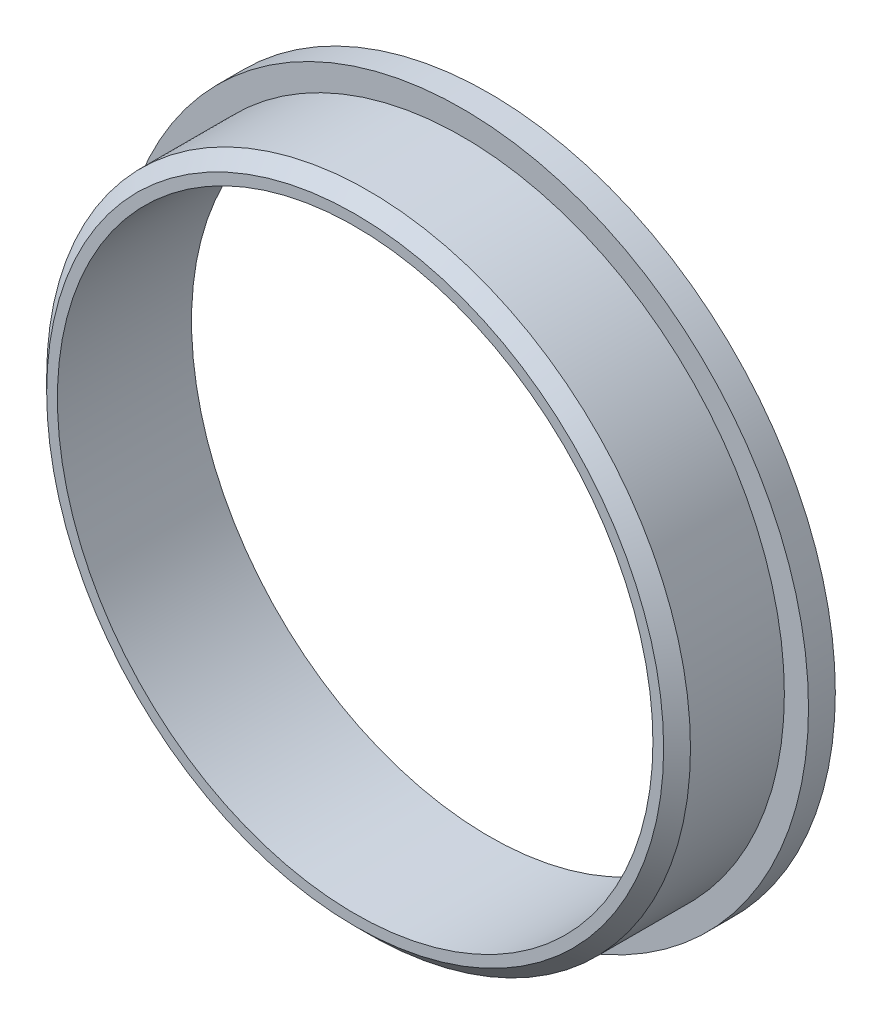
ISO-10303-21;
HEADER;
FILE_DESCRIPTION(('STEP AP214'),'2;1');
FILE_NAME('part.step','',(''),(''),'','','');
FILE_SCHEMA(('AUTOMOTIVE_DESIGN { 1 0 10303 214 1 1 1 1 }'));
ENDSEC;
DATA;
#1=APPLICATION_CONTEXT('core data for automotive mechanical design processes');
#2=APPLICATION_PROTOCOL_DEFINITION('international standard','automotive_design',2000,#1);
#3=PRODUCT_CONTEXT('',#1,'mechanical');
#4=PRODUCT('Part','Part','',(#3));
#5=PRODUCT_RELATED_PRODUCT_CATEGORY('part','',(#4));
#6=PRODUCT_DEFINITION_FORMATION('','',#4);
#7=PRODUCT_DEFINITION_CONTEXT('part definition',#1,'design');
#8=PRODUCT_DEFINITION('design','',#6,#7);
#9=PRODUCT_DEFINITION_SHAPE('','',#8);
#10=(LENGTH_UNIT() NAMED_UNIT(*) SI_UNIT(.MILLI.,.METRE.));
#11=(NAMED_UNIT(*) PLANE_ANGLE_UNIT() SI_UNIT($,.RADIAN.));
#12=(NAMED_UNIT(*) SI_UNIT($,.STERADIAN.) SOLID_ANGLE_UNIT());
#13=UNCERTAINTY_MEASURE_WITH_UNIT(LENGTH_MEASURE(1.E-05),#10,'distance_accuracy_value','');
#14=(GEOMETRIC_REPRESENTATION_CONTEXT(3) GLOBAL_UNCERTAINTY_ASSIGNED_CONTEXT((#13)) GLOBAL_UNIT_ASSIGNED_CONTEXT((#10,
#11,#12)) REPRESENTATION_CONTEXT('',''));
#15=CARTESIAN_POINT('',(0.,0.,0.));
#16=DIRECTION('',(0.,0.,1.));
#17=DIRECTION('',(1.,0.,0.));
#18=AXIS2_PLACEMENT_3D('',#15,#16,#17);
#19=CARTESIAN_POINT('',(0.,0.,5.));
#20=DIRECTION('',(0.,0.,1.));
#21=DIRECTION('',(1.,0.,0.));
#22=AXIS2_PLACEMENT_3D('',#19,#20,#21);
#23=PLANE('',#22);
#24=CARTESIAN_POINT('',(0.,0.,5.));
#25=DIRECTION('',(0.,0.,1.));
#26=DIRECTION('',(1.,0.,0.));
#27=AXIS2_PLACEMENT_3D('',#24,#25,#26);
#28=CIRCLE('',#27,11.5);
#29=CARTESIAN_POINT('',(11.5,0.,5.));
#30=VERTEX_POINT('',#29);
#31=EDGE_CURVE('E41',#30,#30,#28,.T.);
#32=ORIENTED_EDGE('',*,*,#31,.T.);
#33=EDGE_LOOP('',(#32));
#34=FACE_BOUND('',#33,.T.);
#35=CARTESIAN_POINT('',(0.,0.,5.));
#36=DIRECTION('',(0.,0.,1.));
#37=DIRECTION('',(1.,0.,0.));
#38=AXIS2_PLACEMENT_3D('',#35,#36,#37);
#39=CIRCLE('',#38,11.1);
#40=CARTESIAN_POINT('',(11.1,0.,5.));
#41=VERTEX_POINT('',#40);
#42=EDGE_CURVE('E49',#41,#41,#39,.T.);
#43=ORIENTED_EDGE('',*,*,#42,.F.);
#44=EDGE_LOOP('',(#43));
#45=FACE_BOUND('',#44,.T.);
#46=ADVANCED_FACE('F34',(#34,#45),#23,.T.);
#47=CARTESIAN_POINT('',(0.,0.,5.));
#48=DIRECTION('',(0.,0.,-1.));
#49=DIRECTION('',(-1.,0.,0.));
#50=AXIS2_PLACEMENT_3D('',#47,#48,#49);
#51=CYLINDRICAL_SURFACE('',#50,12.9);
#52=CARTESIAN_POINT('',(0.,0.,0.));
#53=DIRECTION('',(0.,0.,1.));
#54=DIRECTION('',(1.,0.,0.));
#55=AXIS2_PLACEMENT_3D('',#52,#53,#54);
#56=CIRCLE('',#55,12.9);
#57=CARTESIAN_POINT('',(12.9,0.,0.));
#58=VERTEX_POINT('',#57);
#59=EDGE_CURVE('E45',#58,#58,#56,.T.);
#60=ORIENTED_EDGE('',*,*,#59,.T.);
#61=EDGE_LOOP('',(#60));
#62=FACE_BOUND('',#61,.T.);
#63=CARTESIAN_POINT('',(0.,0.,1.));
#64=DIRECTION('',(0.,0.,1.));
#65=DIRECTION('',(1.,0.,0.));
#66=AXIS2_PLACEMENT_3D('',#63,#64,#65);
#67=CIRCLE('',#66,12.9);
#68=CARTESIAN_POINT('',(12.9,0.,1.));
#69=VERTEX_POINT('',#68);
#70=EDGE_CURVE('E52',#69,#69,#67,.T.);
#71=ORIENTED_EDGE('',*,*,#70,.F.);
#72=EDGE_LOOP('',(#71));
#73=FACE_BOUND('',#72,.T.);
#74=ADVANCED_FACE('F79',(#62,#73),#51,.T.);
#75=CARTESIAN_POINT('',(0.,0.,0.));
#76=DIRECTION('',(0.,0.,1.));
#77=DIRECTION('',(1.,0.,0.));
#78=AXIS2_PLACEMENT_3D('',#75,#76,#77);
#79=PLANE('',#78);
#80=ORIENTED_EDGE('',*,*,#59,.F.);
#81=EDGE_LOOP('',(#80));
#82=FACE_BOUND('',#81,.T.);
#83=CARTESIAN_POINT('',(0.,0.,0.));
#84=DIRECTION('',(0.,0.,1.));
#85=DIRECTION('',(1.,0.,0.));
#86=AXIS2_PLACEMENT_3D('',#83,#84,#85);
#87=CIRCLE('',#86,11.1);
#88=CARTESIAN_POINT('',(11.1,0.,0.));
#89=VERTEX_POINT('',#88);
#90=EDGE_CURVE('E54',#89,#89,#87,.T.);
#91=ORIENTED_EDGE('',*,*,#90,.T.);
#92=EDGE_LOOP('',(#91));
#93=FACE_BOUND('',#92,.T.);
#94=ADVANCED_FACE('F84',(#82,#93),#79,.F.);
#95=CARTESIAN_POINT('',(0.,0.,5.));
#96=DIRECTION('',(0.,0.,-1.));
#97=DIRECTION('',(-1.,0.,0.));
#98=AXIS2_PLACEMENT_3D('',#95,#96,#97);
#99=CYLINDRICAL_SURFACE('',#98,11.1);
#100=ORIENTED_EDGE('',*,*,#42,.T.);
#101=EDGE_LOOP('',(#100));
#102=FACE_BOUND('',#101,.T.);
#103=ORIENTED_EDGE('',*,*,#90,.F.);
#104=EDGE_LOOP('',(#103));
#105=FACE_BOUND('',#104,.T.);
#106=ADVANCED_FACE('F75',(#102,#105),#99,.F.);
#107=CARTESIAN_POINT('',(0.,0.,1.));
#108=DIRECTION('',(0.,0.,1.));
#109=DIRECTION('',(1.,0.,0.));
#110=AXIS2_PLACEMENT_3D('',#107,#108,#109);
#111=PLANE('',#110);
#112=CARTESIAN_POINT('',(0.,0.,1.));
#113=DIRECTION('',(0.,0.,1.));
#114=DIRECTION('',(1.,0.,0.));
#115=AXIS2_PLACEMENT_3D('',#112,#113,#114);
#116=CIRCLE('',#115,12.);
#117=CARTESIAN_POINT('',(12.,0.,1.));
#118=VERTEX_POINT('',#117);
#119=EDGE_CURVE('E55',#118,#118,#116,.F.);
#120=ORIENTED_EDGE('',*,*,#119,.T.);
#121=EDGE_LOOP('',(#120));
#122=FACE_BOUND('',#121,.T.);
#123=ORIENTED_EDGE('',*,*,#70,.T.);
#124=EDGE_LOOP('',(#123));
#125=FACE_BOUND('',#124,.T.);
#126=ADVANCED_FACE('F64',(#122,#125),#111,.T.);
#127=CARTESIAN_POINT('',(0.,0.,-47.1295618119191));
#128=DIRECTION('',(0.,0.,1.));
#129=DIRECTION('',(1.,0.,0.));
#130=AXIS2_PLACEMENT_3D('',#127,#128,#129);
#131=CYLINDRICAL_SURFACE('',#130,12.);
#132=CARTESIAN_POINT('',(0.,0.,4.5));
#133=DIRECTION('',(0.,0.,1.));
#134=DIRECTION('',(1.,0.,0.));
#135=AXIS2_PLACEMENT_3D('',#132,#133,#134);
#136=CIRCLE('',#135,12.);
#137=CARTESIAN_POINT('',(12.,0.,4.49999999999999));
#138=VERTEX_POINT('',#137);
#139=EDGE_CURVE('E11',#138,#138,#136,.F.);
#140=CARTESIAN_POINT('',(12.,0.,4.49999999999999));
#141=CARTESIAN_POINT('',(12.,0.,4.46354166666666));
#142=CARTESIAN_POINT('',(12.,0.,4.42708333333332));
#143=CARTESIAN_POINT('',(12.,0.,4.35416666666666));
#144=CARTESIAN_POINT('',(12.,0.,4.31770833333333));
#145=CARTESIAN_POINT('',(12.,0.,4.24479166666666));
#146=CARTESIAN_POINT('',(12.,0.,4.20833333333333));
#147=CARTESIAN_POINT('',(12.,0.,4.13541666666666));
#148=CARTESIAN_POINT('',(12.,0.,4.09895833333332));
#149=CARTESIAN_POINT('',(12.,0.,4.02604166666666));
#150=CARTESIAN_POINT('',(12.,0.,3.98958333333333));
#151=CARTESIAN_POINT('',(12.,0.,3.91666666666666));
#152=CARTESIAN_POINT('',(12.,0.,3.88020833333333));
#153=CARTESIAN_POINT('',(12.,0.,3.80729166666666));
#154=CARTESIAN_POINT('',(12.,0.,3.77083333333333));
#155=CARTESIAN_POINT('',(12.,0.,3.69791666666666));
#156=CARTESIAN_POINT('',(12.,0.,3.66145833333332));
#157=CARTESIAN_POINT('',(12.,0.,3.58854166666666));
#158=CARTESIAN_POINT('',(12.,0.,3.55208333333333));
#159=CARTESIAN_POINT('',(12.,0.,3.47916666666666));
#160=CARTESIAN_POINT('',(12.,0.,3.44270833333333));
#161=CARTESIAN_POINT('',(12.,0.,3.36979166666666));
#162=CARTESIAN_POINT('',(12.,0.,3.33333333333333));
#163=CARTESIAN_POINT('',(12.,0.,3.26041666666666));
#164=CARTESIAN_POINT('',(12.,0.,3.22395833333333));
#165=CARTESIAN_POINT('',(12.,0.,3.15104166666666));
#166=CARTESIAN_POINT('',(12.,0.,3.11458333333333));
#167=CARTESIAN_POINT('',(12.,0.,3.04166666666666));
#168=CARTESIAN_POINT('',(12.,0.,3.00520833333333));
#169=CARTESIAN_POINT('',(12.,0.,2.93229166666666));
#170=CARTESIAN_POINT('',(12.,0.,2.89583333333333));
#171=CARTESIAN_POINT('',(12.,0.,2.82291666666666));
#172=CARTESIAN_POINT('',(12.,0.,2.78645833333333));
#173=CARTESIAN_POINT('',(12.,0.,2.71354166666666));
#174=CARTESIAN_POINT('',(12.,0.,2.67708333333333));
#175=CARTESIAN_POINT('',(12.,0.,2.60416666666666));
#176=CARTESIAN_POINT('',(12.,0.,2.56770833333333));
#177=CARTESIAN_POINT('',(12.,0.,2.49479166666666));
#178=CARTESIAN_POINT('',(12.,0.,2.45833333333333));
#179=CARTESIAN_POINT('',(12.,0.,2.38541666666666));
#180=CARTESIAN_POINT('',(12.,0.,2.34895833333333));
#181=CARTESIAN_POINT('',(12.,0.,2.27604166666666));
#182=CARTESIAN_POINT('',(12.,0.,2.23958333333333));
#183=CARTESIAN_POINT('',(12.,0.,2.16666666666667));
#184=CARTESIAN_POINT('',(12.,0.,2.13020833333333));
#185=CARTESIAN_POINT('',(12.,0.,2.05729166666666));
#186=CARTESIAN_POINT('',(12.,0.,2.02083333333333));
#187=CARTESIAN_POINT('',(12.,0.,1.94791666666666));
#188=CARTESIAN_POINT('',(12.,0.,1.91145833333333));
#189=CARTESIAN_POINT('',(12.,0.,1.83854166666667));
#190=CARTESIAN_POINT('',(12.,0.,1.80208333333333));
#191=CARTESIAN_POINT('',(12.,0.,1.72916666666667));
#192=CARTESIAN_POINT('',(12.,0.,1.69270833333333));
#193=CARTESIAN_POINT('',(12.,0.,1.61979166666666));
#194=CARTESIAN_POINT('',(12.,0.,1.58333333333333));
#195=CARTESIAN_POINT('',(12.,0.,1.51041666666666));
#196=CARTESIAN_POINT('',(12.,0.,1.47395833333333));
#197=CARTESIAN_POINT('',(12.,0.,1.40104166666667));
#198=CARTESIAN_POINT('',(12.,0.,1.36458333333333));
#199=CARTESIAN_POINT('',(12.,0.,1.29166666666667));
#200=CARTESIAN_POINT('',(12.,0.,1.25520833333333));
#201=CARTESIAN_POINT('',(12.,0.,1.18229166666667));
#202=CARTESIAN_POINT('',(12.,0.,1.14583333333333));
#203=CARTESIAN_POINT('',(12.,0.,1.07291666666667));
#204=CARTESIAN_POINT('',(12.,0.,1.03645833333333));
#205=CARTESIAN_POINT('',(12.,0.,1.));
#206=B_SPLINE_CURVE_WITH_KNOTS('',3,(#140,#141,#142,#143,#144,#145,#146,#147,#148,#149,#150,
#151,#152,#153,#154,#155,#156,#157,#158,#159,#160,#161,#162,#163,#164,#165,#166,#167,#168,#169,
#170,#171,#172,#173,#174,#175,#176,#177,#178,#179,#180,#181,#182,#183,#184,#185,#186,#187,#188,
#189,#190,#191,#192,#193,#194,#195,#196,#197,#198,#199,#200,#201,#202,#203,#204,#205),
.UNSPECIFIED.,.F.,.F.,(4,2,2,2,2,2,2,2,2,2,2,2,2,2,2,2,2,2,2,2,2,2,2,2,2,2,2,2,2,2,2,2,4),(0.,
0.109375000000002,0.218749999999997,0.328124999999999,0.4375,0.546874999999995,
0.656249999999997,0.765624999999999,0.875000000000001,0.984374999999996,1.09375,1.203125,
1.31249999999999,1.421875,1.53125,1.64062499999999,1.74999999999999,1.859375,1.96874999999999,
2.07812499999999,2.1875,2.29687499999999,2.40624999999999,2.51562499999999,2.62499999999999,
2.73437499999999,2.84374999999999,2.95312499999999,3.06249999999999,3.17187499999999,
3.28124999999999,3.39062499999999,3.49999999999999),.UNSPECIFIED.);
#207=EDGE_CURVE('BSEAM67',#138,#118,#206,.T.);
#208=ORIENTED_EDGE('',*,*,#139,.T.);
#209=ORIENTED_EDGE('',*,*,#119,.F.);
#210=ORIENTED_EDGE('',*,*,#207,.T.);
#211=ORIENTED_EDGE('',*,*,#207,.F.);
#212=EDGE_LOOP('',(#208,#210,#209,#211));
#213=FACE_BOUND('',#212,.T.);
#214=ADVANCED_FACE('F67',(#213),#131,.T.);
#215=CARTESIAN_POINT('',(0.,0.,5.));
#216=DIRECTION('',(0.,0.,-1.));
#217=DIRECTION('',(-1.,0.,0.));
#218=AXIS2_PLACEMENT_3D('',#215,#216,#217);
#219=CONICAL_SURFACE('',#218,11.5,0.785398163397452);
#220=ORIENTED_EDGE('',*,*,#139,.F.);
#221=EDGE_LOOP('',(#220));
#222=FACE_BOUND('',#221,.T.);
#223=ORIENTED_EDGE('',*,*,#31,.F.);
#224=EDGE_LOOP('',(#223));
#225=FACE_BOUND('',#224,.T.);
#226=ADVANCED_FACE('F36',(#222,#225),#219,.T.);
#227=CLOSED_SHELL('',(#46,#74,#94,#106,#126,#214,#226));
#228=MANIFOLD_SOLID_BREP('B2',#227);
#229=ADVANCED_BREP_SHAPE_REPRESENTATION('',(#18,#228),#14);
#230=SHAPE_DEFINITION_REPRESENTATION(#9,#229);
ENDSEC;
END-ISO-10303-21;
